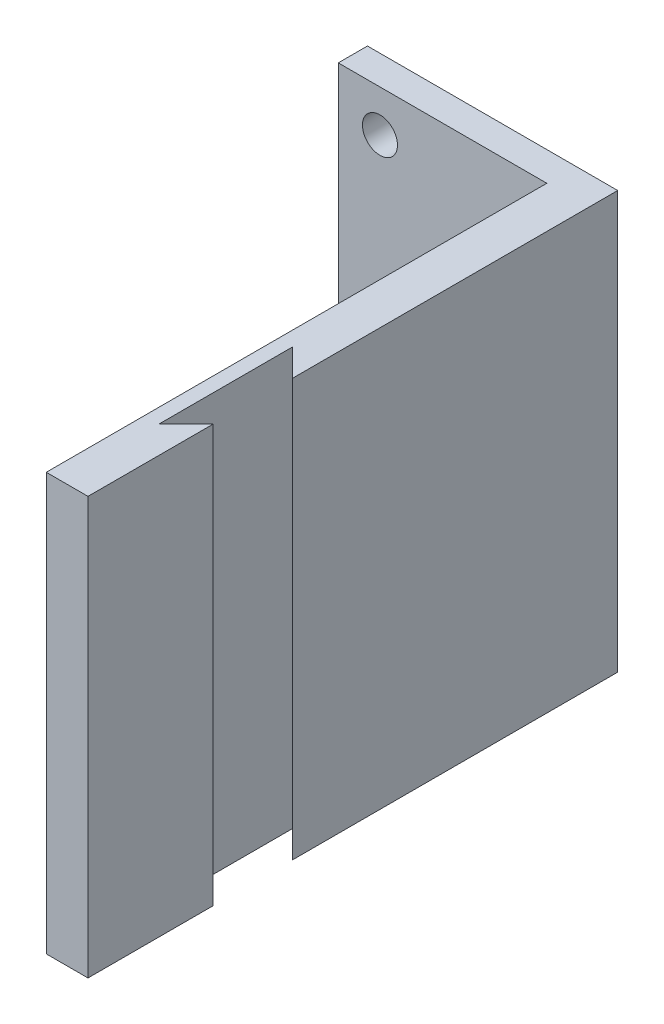
ISO-10303-21;
HEADER;
FILE_DESCRIPTION(('STEP AP214'),'2;1');
FILE_NAME('part.step','',(''),(''),'','','');
FILE_SCHEMA(('AUTOMOTIVE_DESIGN { 1 0 10303 214 1 1 1 1 }'));
ENDSEC;
DATA;
#1=APPLICATION_CONTEXT('core data for automotive mechanical design processes');
#2=APPLICATION_PROTOCOL_DEFINITION('international standard','automotive_design',2000,#1);
#3=PRODUCT_CONTEXT('',#1,'mechanical');
#4=PRODUCT('Part','Part','',(#3));
#5=PRODUCT_RELATED_PRODUCT_CATEGORY('part','',(#4));
#6=PRODUCT_DEFINITION_FORMATION('','',#4);
#7=PRODUCT_DEFINITION_CONTEXT('part definition',#1,'design');
#8=PRODUCT_DEFINITION('design','',#6,#7);
#9=PRODUCT_DEFINITION_SHAPE('','',#8);
#10=(LENGTH_UNIT() NAMED_UNIT(*) SI_UNIT(.MILLI.,.METRE.));
#11=(NAMED_UNIT(*) PLANE_ANGLE_UNIT() SI_UNIT($,.RADIAN.));
#12=(NAMED_UNIT(*) SI_UNIT($,.STERADIAN.) SOLID_ANGLE_UNIT());
#13=UNCERTAINTY_MEASURE_WITH_UNIT(LENGTH_MEASURE(1.E-05),#10,'distance_accuracy_value','');
#14=(GEOMETRIC_REPRESENTATION_CONTEXT(3) GLOBAL_UNCERTAINTY_ASSIGNED_CONTEXT((#13)) GLOBAL_UNIT_ASSIGNED_CONTEXT((#10,
#11,#12)) REPRESENTATION_CONTEXT('',''));
#15=CARTESIAN_POINT('',(0.,0.,0.));
#16=DIRECTION('',(0.,0.,1.));
#17=DIRECTION('',(1.,0.,0.));
#18=AXIS2_PLACEMENT_3D('',#15,#16,#17);
#19=CARTESIAN_POINT('',(15.,-25.,3.5));
#20=DIRECTION('',(-1.,0.,0.));
#21=DIRECTION('',(0.,0.,1.));
#22=AXIS2_PLACEMENT_3D('',#19,#20,#21);
#23=PLANE('',#22);
#24=DIRECTION('',(0.,0.,-1.));
#25=VECTOR('',#24,1.);
#26=CARTESIAN_POINT('',(15.,25.,3.5));
#27=LINE('',#26,#25);
#28=CARTESIAN_POINT('',(15.,25.,39.));
#29=VERTEX_POINT('',#28);
#30=CARTESIAN_POINT('',(15.,25.,0.));
#31=VERTEX_POINT('',#30);
#32=EDGE_CURVE('E46',#29,#31,#27,.T.);
#33=ORIENTED_EDGE('',*,*,#32,.F.);
#34=DIRECTION('',(0.,-1.,0.));
#35=VECTOR('',#34,1.);
#36=CARTESIAN_POINT('',(15.,25.001,39.));
#37=LINE('',#36,#35);
#38=CARTESIAN_POINT('',(15.,-25.,39.));
#39=VERTEX_POINT('',#38);
#40=EDGE_CURVE('E120',#29,#39,#37,.T.);
#41=ORIENTED_EDGE('',*,*,#40,.T.);
#42=DIRECTION('',(0.,0.,-1.));
#43=VECTOR('',#42,1.);
#44=CARTESIAN_POINT('',(15.,-25.,3.5));
#45=LINE('',#44,#43);
#46=CARTESIAN_POINT('',(15.,-25.,0.));
#47=VERTEX_POINT('',#46);
#48=EDGE_CURVE('E171',#39,#47,#45,.T.);
#49=ORIENTED_EDGE('',*,*,#48,.T.);
#50=DIRECTION('',(0.,1.,0.));
#51=VECTOR('',#50,1.);
#52=CARTESIAN_POINT('',(15.,-25.,0.));
#53=LINE('',#52,#51);
#54=EDGE_CURVE('E161',#47,#31,#53,.T.);
#55=ORIENTED_EDGE('',*,*,#54,.T.);
#56=EDGE_LOOP('',(#33,#41,#49,#55));
#57=FACE_BOUND('',#56,.T.);
#58=ADVANCED_FACE('F38',(#57),#23,.F.);
#59=CARTESIAN_POINT('',(0.,0.,3.5));
#60=DIRECTION('',(0.,0.,-1.));
#61=DIRECTION('',(-1.,0.,0.));
#62=AXIS2_PLACEMENT_3D('',#59,#60,#61);
#63=PLANE('',#62);
#64=CARTESIAN_POINT('',(-10.,20.,3.5));
#65=DIRECTION('',(0.,0.,1.));
#66=DIRECTION('',(-1.,0.,0.));
#67=AXIS2_PLACEMENT_3D('',#64,#65,#66);
#68=CIRCLE('',#67,2.1);
#69=CARTESIAN_POINT('',(-12.1,20.,3.5));
#70=VERTEX_POINT('',#69);
#71=EDGE_CURVE('E152',#70,#70,#68,.T.);
#72=ORIENTED_EDGE('',*,*,#71,.F.);
#73=EDGE_LOOP('',(#72));
#74=FACE_BOUND('',#73,.T.);
#75=CARTESIAN_POINT('',(-10.,-20.,3.5));
#76=DIRECTION('',(0.,0.,1.));
#77=DIRECTION('',(1.,0.,0.));
#78=AXIS2_PLACEMENT_3D('',#75,#76,#77);
#79=CIRCLE('',#78,2.1);
#80=CARTESIAN_POINT('',(-7.9,-20.,3.5));
#81=VERTEX_POINT('',#80);
#82=EDGE_CURVE('E158',#81,#81,#79,.T.);
#83=ORIENTED_EDGE('',*,*,#82,.F.);
#84=EDGE_LOOP('',(#83));
#85=FACE_BOUND('',#84,.T.);
#86=DIRECTION('',(0.,-1.,0.));
#87=VECTOR('',#86,1.);
#88=CARTESIAN_POINT('',(9.99999999999999,-25.,3.5));
#89=LINE('',#88,#87);
#90=CARTESIAN_POINT('',(10.,25.,3.5));
#91=VERTEX_POINT('',#90);
#92=CARTESIAN_POINT('',(9.99999999999999,-25.,3.5));
#93=VERTEX_POINT('',#92);
#94=EDGE_CURVE('E61',#91,#93,#89,.T.);
#95=ORIENTED_EDGE('',*,*,#94,.F.);
#96=DIRECTION('',(-1.,0.,0.));
#97=VECTOR('',#96,1.);
#98=CARTESIAN_POINT('',(-15.,25.,3.5));
#99=LINE('',#98,#97);
#100=CARTESIAN_POINT('',(-15.,25.,3.5));
#101=VERTEX_POINT('',#100);
#102=EDGE_CURVE('E164',#91,#101,#99,.T.);
#103=ORIENTED_EDGE('',*,*,#102,.T.);
#104=DIRECTION('',(0.,-1.,0.));
#105=VECTOR('',#104,1.);
#106=CARTESIAN_POINT('',(-15.,-25.,3.5));
#107=LINE('',#106,#105);
#108=CARTESIAN_POINT('',(-15.,-25.,3.5));
#109=VERTEX_POINT('',#108);
#110=EDGE_CURVE('E166',#101,#109,#107,.T.);
#111=ORIENTED_EDGE('',*,*,#110,.T.);
#112=DIRECTION('',(1.,0.,0.));
#113=VECTOR('',#112,1.);
#114=CARTESIAN_POINT('',(-15.,-25.,3.5));
#115=LINE('',#114,#113);
#116=EDGE_CURVE('E169',#109,#93,#115,.T.);
#117=ORIENTED_EDGE('',*,*,#116,.T.);
#118=EDGE_LOOP('',(#95,#103,#111,#117));
#119=FACE_BOUND('',#118,.T.);
#120=ADVANCED_FACE('F208',(#74,#85,#119),#63,.F.);
#121=CARTESIAN_POINT('',(0.,0.,0.));
#122=DIRECTION('',(0.,0.,-1.));
#123=DIRECTION('',(-1.,0.,0.));
#124=AXIS2_PLACEMENT_3D('',#121,#122,#123);
#125=PLANE('',#124);
#126=CARTESIAN_POINT('',(-10.,-20.,0.));
#127=DIRECTION('',(0.,0.,1.));
#128=DIRECTION('',(1.,0.,0.));
#129=AXIS2_PLACEMENT_3D('',#126,#127,#128);
#130=CIRCLE('',#129,2.1);
#131=CARTESIAN_POINT('',(-7.9,-20.,0.));
#132=VERTEX_POINT('',#131);
#133=EDGE_CURVE('E155',#132,#132,#130,.T.);
#134=ORIENTED_EDGE('',*,*,#133,.T.);
#135=EDGE_LOOP('',(#134));
#136=FACE_BOUND('',#135,.T.);
#137=ORIENTED_EDGE('',*,*,#54,.F.);
#138=DIRECTION('',(1.,0.,0.));
#139=VECTOR('',#138,1.);
#140=CARTESIAN_POINT('',(-15.,-25.,0.));
#141=LINE('',#140,#139);
#142=CARTESIAN_POINT('',(-15.,-25.,0.));
#143=VERTEX_POINT('',#142);
#144=EDGE_CURVE('E167',#143,#47,#141,.T.);
#145=ORIENTED_EDGE('',*,*,#144,.F.);
#146=DIRECTION('',(0.,-1.,0.));
#147=VECTOR('',#146,1.);
#148=CARTESIAN_POINT('',(-15.,-25.,0.));
#149=LINE('',#148,#147);
#150=CARTESIAN_POINT('',(-15.,25.,0.));
#151=VERTEX_POINT('',#150);
#152=EDGE_CURVE('E176',#151,#143,#149,.T.);
#153=ORIENTED_EDGE('',*,*,#152,.F.);
#154=DIRECTION('',(-1.,0.,0.));
#155=VECTOR('',#154,1.);
#156=CARTESIAN_POINT('',(-15.,25.,0.));
#157=LINE('',#156,#155);
#158=EDGE_CURVE('E174',#31,#151,#157,.T.);
#159=ORIENTED_EDGE('',*,*,#158,.F.);
#160=EDGE_LOOP('',(#137,#145,#153,#159));
#161=FACE_BOUND('',#160,.T.);
#162=CARTESIAN_POINT('',(-10.,20.,0.));
#163=DIRECTION('',(0.,0.,1.));
#164=DIRECTION('',(-1.,0.,0.));
#165=AXIS2_PLACEMENT_3D('',#162,#163,#164);
#166=CIRCLE('',#165,2.1);
#167=CARTESIAN_POINT('',(-12.1,20.,0.));
#168=VERTEX_POINT('',#167);
#169=EDGE_CURVE('E151',#168,#168,#166,.T.);
#170=ORIENTED_EDGE('',*,*,#169,.T.);
#171=EDGE_LOOP('',(#170));
#172=FACE_BOUND('',#171,.T.);
#173=ADVANCED_FACE('F198',(#136,#161,#172),#125,.T.);
#174=CARTESIAN_POINT('',(15.,-25.,63.5));
#175=VERTEX_POINT('',#174);
#176=CARTESIAN_POINT('',(15.,-25.,48.5));
#177=VERTEX_POINT('',#176);
#178=EDGE_CURVE('E126',#175,#177,#45,.T.);
#179=ORIENTED_EDGE('',*,*,#178,.T.);
#180=DIRECTION('',(0.,-1.,0.));
#181=VECTOR('',#180,1.);
#182=CARTESIAN_POINT('',(15.,25.001,48.5));
#183=LINE('',#182,#181);
#184=CARTESIAN_POINT('',(15.,25.,48.5));
#185=VERTEX_POINT('',#184);
#186=EDGE_CURVE('E53',#185,#177,#183,.T.);
#187=ORIENTED_EDGE('',*,*,#186,.F.);
#188=CARTESIAN_POINT('',(15.,25.,63.5));
#189=VERTEX_POINT('',#188);
#190=EDGE_CURVE('E11',#189,#185,#27,.T.);
#191=ORIENTED_EDGE('',*,*,#190,.F.);
#192=DIRECTION('',(0.,1.,0.));
#193=VECTOR('',#192,1.);
#194=CARTESIAN_POINT('',(15.,25.,63.5));
#195=LINE('',#194,#193);
#196=EDGE_CURVE('E145',#175,#189,#195,.T.);
#197=ORIENTED_EDGE('',*,*,#196,.F.);
#198=EDGE_LOOP('',(#179,#187,#191,#197));
#199=FACE_BOUND('',#198,.T.);
#200=ADVANCED_FACE('F40',(#199),#23,.F.);
#201=CARTESIAN_POINT('',(-15.,25.,3.5));
#202=DIRECTION('',(0.,-1.,0.));
#203=DIRECTION('',(0.,0.,-1.));
#204=AXIS2_PLACEMENT_3D('',#201,#202,#203);
#205=PLANE('',#204);
#206=DIRECTION('',(0.,0.,1.));
#207=VECTOR('',#206,1.);
#208=CARTESIAN_POINT('',(11.75,25.,51.75));
#209=LINE('',#208,#207);
#210=CARTESIAN_POINT('',(11.75,25.,35.75));
#211=VERTEX_POINT('',#210);
#212=CARTESIAN_POINT('',(11.75,25.,51.75));
#213=VERTEX_POINT('',#212);
#214=EDGE_CURVE('E220',#211,#213,#209,.T.);
#215=ORIENTED_EDGE('',*,*,#214,.F.);
#216=DIRECTION('',(-0.707106781186548,0.,-0.707106781186547));
#217=VECTOR('',#216,1.);
#218=CARTESIAN_POINT('',(11.75,25.,35.75));
#219=LINE('',#218,#217);
#220=EDGE_CURVE('E193',#29,#211,#219,.T.);
#221=ORIENTED_EDGE('',*,*,#220,.F.);
#222=ORIENTED_EDGE('',*,*,#32,.T.);
#223=ORIENTED_EDGE('',*,*,#158,.T.);
#224=DIRECTION('',(0.,0.,-1.));
#225=VECTOR('',#224,1.);
#226=CARTESIAN_POINT('',(-15.,25.,3.5));
#227=LINE('',#226,#225);
#228=EDGE_CURVE('E183',#101,#151,#227,.T.);
#229=ORIENTED_EDGE('',*,*,#228,.F.);
#230=ORIENTED_EDGE('',*,*,#102,.F.);
#231=DIRECTION('',(0.,0.,-1.));
#232=VECTOR('',#231,1.);
#233=CARTESIAN_POINT('',(9.99999999999999,25.,63.5));
#234=LINE('',#233,#232);
#235=CARTESIAN_POINT('',(9.99999999999999,25.,63.5));
#236=VERTEX_POINT('',#235);
#237=EDGE_CURVE('E135',#236,#91,#234,.T.);
#238=ORIENTED_EDGE('',*,*,#237,.F.);
#239=DIRECTION('',(-1.,0.,0.));
#240=VECTOR('',#239,1.);
#241=CARTESIAN_POINT('',(9.99999999999999,25.,63.5));
#242=LINE('',#241,#240);
#243=EDGE_CURVE('E133',#189,#236,#242,.T.);
#244=ORIENTED_EDGE('',*,*,#243,.F.);
#245=ORIENTED_EDGE('',*,*,#190,.T.);
#246=DIRECTION('',(0.707106781186547,0.,-0.707106781186548));
#247=VECTOR('',#246,1.);
#248=CARTESIAN_POINT('',(15.,25.,48.5));
#249=LINE('',#248,#247);
#250=EDGE_CURVE('E114',#213,#185,#249,.T.);
#251=ORIENTED_EDGE('',*,*,#250,.F.);
#252=EDGE_LOOP('',(#215,#221,#222,#223,#229,#230,#238,#244,#245,#251));
#253=FACE_BOUND('',#252,.T.);
#254=ADVANCED_FACE('F130',(#253),#205,.F.);
#255=CARTESIAN_POINT('',(-15.,-25.,3.5));
#256=DIRECTION('',(1.,0.,0.));
#257=DIRECTION('',(0.,0.,-1.));
#258=AXIS2_PLACEMENT_3D('',#255,#256,#257);
#259=PLANE('',#258);
#260=ORIENTED_EDGE('',*,*,#152,.T.);
#261=DIRECTION('',(0.,0.,-1.));
#262=VECTOR('',#261,1.);
#263=CARTESIAN_POINT('',(-15.,-25.,3.5));
#264=LINE('',#263,#262);
#265=EDGE_CURVE('E181',#109,#143,#264,.T.);
#266=ORIENTED_EDGE('',*,*,#265,.F.);
#267=ORIENTED_EDGE('',*,*,#110,.F.);
#268=ORIENTED_EDGE('',*,*,#228,.T.);
#269=EDGE_LOOP('',(#260,#266,#267,#268));
#270=FACE_BOUND('',#269,.T.);
#271=ADVANCED_FACE('F207',(#270),#259,.F.);
#272=CARTESIAN_POINT('',(-15.,-25.,3.5));
#273=DIRECTION('',(0.,1.,0.));
#274=DIRECTION('',(0.,0.,1.));
#275=AXIS2_PLACEMENT_3D('',#272,#273,#274);
#276=PLANE('',#275);
#277=ORIENTED_EDGE('',*,*,#48,.F.);
#278=DIRECTION('',(0.707106781186548,0.,0.707106781186547));
#279=VECTOR('',#278,1.);
#280=CARTESIAN_POINT('',(11.75,-25.,35.75));
#281=LINE('',#280,#279);
#282=CARTESIAN_POINT('',(11.75,-25.,35.75));
#283=VERTEX_POINT('',#282);
#284=EDGE_CURVE('E127',#283,#39,#281,.T.);
#285=ORIENTED_EDGE('',*,*,#284,.F.);
#286=DIRECTION('',(0.,0.,-1.));
#287=VECTOR('',#286,1.);
#288=CARTESIAN_POINT('',(11.75,-25.,51.75));
#289=LINE('',#288,#287);
#290=CARTESIAN_POINT('',(11.75,-25.,51.75));
#291=VERTEX_POINT('',#290);
#292=EDGE_CURVE('E217',#291,#283,#289,.T.);
#293=ORIENTED_EDGE('',*,*,#292,.F.);
#294=DIRECTION('',(-0.707106781186547,0.,0.707106781186548));
#295=VECTOR('',#294,1.);
#296=CARTESIAN_POINT('',(15.,-25.,48.5));
#297=LINE('',#296,#295);
#298=EDGE_CURVE('E215',#177,#291,#297,.T.);
#299=ORIENTED_EDGE('',*,*,#298,.F.);
#300=ORIENTED_EDGE('',*,*,#178,.F.);
#301=DIRECTION('',(1.,0.,0.));
#302=VECTOR('',#301,1.);
#303=CARTESIAN_POINT('',(15.,-25.,63.5));
#304=LINE('',#303,#302);
#305=CARTESIAN_POINT('',(9.99999999999999,-25.,63.5));
#306=VERTEX_POINT('',#305);
#307=EDGE_CURVE('E139',#306,#175,#304,.T.);
#308=ORIENTED_EDGE('',*,*,#307,.F.);
#309=DIRECTION('',(0.,0.,-1.));
#310=VECTOR('',#309,1.);
#311=CARTESIAN_POINT('',(9.99999999999999,-25.,63.5));
#312=LINE('',#311,#310);
#313=EDGE_CURVE('E146',#306,#93,#312,.T.);
#314=ORIENTED_EDGE('',*,*,#313,.T.);
#315=ORIENTED_EDGE('',*,*,#116,.F.);
#316=ORIENTED_EDGE('',*,*,#265,.T.);
#317=ORIENTED_EDGE('',*,*,#144,.T.);
#318=EDGE_LOOP('',(#277,#285,#293,#299,#300,#308,#314,#315,#316,#317));
#319=FACE_BOUND('',#318,.T.);
#320=ADVANCED_FACE('F204',(#319),#276,.F.);
#321=CARTESIAN_POINT('',(-10.,-20.,3.5));
#322=DIRECTION('',(0.,0.,-1.));
#323=DIRECTION('',(-1.,0.,0.));
#324=AXIS2_PLACEMENT_3D('',#321,#322,#323);
#325=CYLINDRICAL_SURFACE('',#324,2.1);
#326=ORIENTED_EDGE('',*,*,#82,.T.);
#327=EDGE_LOOP('',(#326));
#328=FACE_BOUND('',#327,.T.);
#329=ORIENTED_EDGE('',*,*,#133,.F.);
#330=EDGE_LOOP('',(#329));
#331=FACE_BOUND('',#330,.T.);
#332=ADVANCED_FACE('F260',(#328,#331),#325,.F.);
#333=CARTESIAN_POINT('',(-10.,20.,3.5));
#334=DIRECTION('',(0.,0.,-1.));
#335=DIRECTION('',(-1.,0.,0.));
#336=AXIS2_PLACEMENT_3D('',#333,#334,#335);
#337=CYLINDRICAL_SURFACE('',#336,2.1);
#338=ORIENTED_EDGE('',*,*,#71,.T.);
#339=EDGE_LOOP('',(#338));
#340=FACE_BOUND('',#339,.T.);
#341=ORIENTED_EDGE('',*,*,#169,.F.);
#342=EDGE_LOOP('',(#341));
#343=FACE_BOUND('',#342,.T.);
#344=ADVANCED_FACE('F272',(#340,#343),#337,.F.);
#345=CARTESIAN_POINT('',(9.99999999999999,-25.,63.5));
#346=DIRECTION('',(1.,0.,0.));
#347=DIRECTION('',(0.,0.,-1.));
#348=AXIS2_PLACEMENT_3D('',#345,#346,#347);
#349=PLANE('',#348);
#350=ORIENTED_EDGE('',*,*,#94,.T.);
#351=ORIENTED_EDGE('',*,*,#313,.F.);
#352=DIRECTION('',(0.,-1.,0.));
#353=VECTOR('',#352,1.);
#354=CARTESIAN_POINT('',(9.99999999999999,-25.,63.5));
#355=LINE('',#354,#353);
#356=EDGE_CURVE('E137',#236,#306,#355,.T.);
#357=ORIENTED_EDGE('',*,*,#356,.F.);
#358=ORIENTED_EDGE('',*,*,#237,.T.);
#359=EDGE_LOOP('',(#350,#351,#357,#358));
#360=FACE_BOUND('',#359,.T.);
#361=ADVANCED_FACE('F210',(#360),#349,.F.);
#362=CARTESIAN_POINT('',(0.,0.,63.5));
#363=DIRECTION('',(0.,0.,-1.));
#364=DIRECTION('',(-1.,0.,0.));
#365=AXIS2_PLACEMENT_3D('',#362,#363,#364);
#366=PLANE('',#365);
#367=ORIENTED_EDGE('',*,*,#243,.T.);
#368=ORIENTED_EDGE('',*,*,#356,.T.);
#369=ORIENTED_EDGE('',*,*,#307,.T.);
#370=ORIENTED_EDGE('',*,*,#196,.T.);
#371=EDGE_LOOP('',(#367,#368,#369,#370));
#372=FACE_BOUND('',#371,.T.);
#373=ADVANCED_FACE('F213',(#372),#366,.F.);
#374=CARTESIAN_POINT('',(11.75,25.001,35.75));
#375=DIRECTION('',(0.707106781186547,0.,-0.707106781186548));
#376=DIRECTION('',(-0.707106781186548,0.,-0.707106781186547));
#377=AXIS2_PLACEMENT_3D('',#374,#375,#376);
#378=PLANE('',#377);
#379=ORIENTED_EDGE('',*,*,#220,.T.);
#380=DIRECTION('',(0.,-1.,0.));
#381=VECTOR('',#380,1.);
#382=CARTESIAN_POINT('',(11.75,25.001,35.75));
#383=LINE('',#382,#381);
#384=EDGE_CURVE('E226',#211,#283,#383,.T.);
#385=ORIENTED_EDGE('',*,*,#384,.T.);
#386=ORIENTED_EDGE('',*,*,#284,.T.);
#387=ORIENTED_EDGE('',*,*,#40,.F.);
#388=EDGE_LOOP('',(#379,#385,#386,#387));
#389=FACE_BOUND('',#388,.T.);
#390=ADVANCED_FACE('F231',(#389),#378,.F.);
#391=CARTESIAN_POINT('',(11.75,25.001,51.75));
#392=DIRECTION('',(-1.,0.,0.));
#393=DIRECTION('',(0.,0.,1.));
#394=AXIS2_PLACEMENT_3D('',#391,#392,#393);
#395=PLANE('',#394);
#396=ORIENTED_EDGE('',*,*,#214,.T.);
#397=DIRECTION('',(0.,-1.,0.));
#398=VECTOR('',#397,1.);
#399=CARTESIAN_POINT('',(11.75,25.001,51.75));
#400=LINE('',#399,#398);
#401=EDGE_CURVE('E116',#213,#291,#400,.T.);
#402=ORIENTED_EDGE('',*,*,#401,.T.);
#403=ORIENTED_EDGE('',*,*,#292,.T.);
#404=ORIENTED_EDGE('',*,*,#384,.F.);
#405=EDGE_LOOP('',(#396,#402,#403,#404));
#406=FACE_BOUND('',#405,.T.);
#407=ADVANCED_FACE('F229',(#406),#395,.F.);
#408=CARTESIAN_POINT('',(15.,25.001,48.5));
#409=DIRECTION('',(0.707106781186548,0.,0.707106781186547));
#410=DIRECTION('',(0.707106781186547,0.,-0.707106781186548));
#411=AXIS2_PLACEMENT_3D('',#408,#409,#410);
#412=PLANE('',#411);
#413=ORIENTED_EDGE('',*,*,#250,.T.);
#414=ORIENTED_EDGE('',*,*,#186,.T.);
#415=ORIENTED_EDGE('',*,*,#298,.T.);
#416=ORIENTED_EDGE('',*,*,#401,.F.);
#417=EDGE_LOOP('',(#413,#414,#415,#416));
#418=FACE_BOUND('',#417,.T.);
#419=ADVANCED_FACE('F115',(#418),#412,.F.);
#420=CLOSED_SHELL('',(#58,#120,#173,#200,#254,#271,#320,#332,#344,#361,#373,#390,#407,#419));
#421=MANIFOLD_SOLID_BREP('B2',#420);
#422=ADVANCED_BREP_SHAPE_REPRESENTATION('',(#18,#421),#14);
#423=SHAPE_DEFINITION_REPRESENTATION(#9,#422);
ENDSEC;
END-ISO-10303-21;
